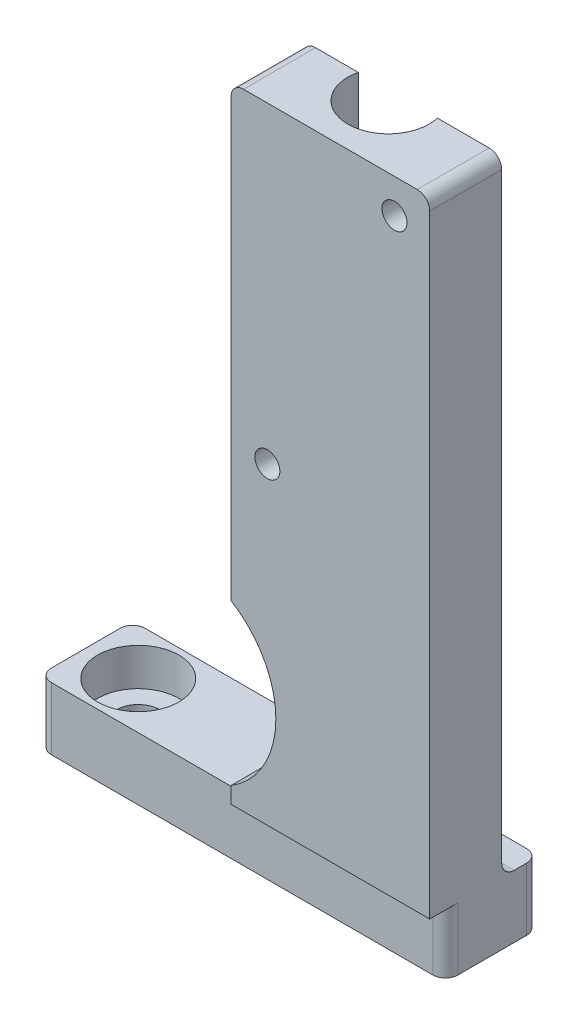
ISO-10303-21;
HEADER;
FILE_DESCRIPTION(('STEP AP214'),'2;1');
FILE_NAME('part.step','',(''),(''),'','','');
FILE_SCHEMA(('AUTOMOTIVE_DESIGN { 1 0 10303 214 1 1 1 1 }'));
ENDSEC;
DATA;
#1=APPLICATION_CONTEXT('core data for automotive mechanical design processes');
#2=APPLICATION_PROTOCOL_DEFINITION('international standard','automotive_design',2000,#1);
#3=PRODUCT_CONTEXT('',#1,'mechanical');
#4=PRODUCT('Part','Part','',(#3));
#5=PRODUCT_RELATED_PRODUCT_CATEGORY('part','',(#4));
#6=PRODUCT_DEFINITION_FORMATION('','',#4);
#7=PRODUCT_DEFINITION_CONTEXT('part definition',#1,'design');
#8=PRODUCT_DEFINITION('design','',#6,#7);
#9=PRODUCT_DEFINITION_SHAPE('','',#8);
#10=(LENGTH_UNIT() NAMED_UNIT(*) SI_UNIT(.MILLI.,.METRE.));
#11=(NAMED_UNIT(*) PLANE_ANGLE_UNIT() SI_UNIT($,.RADIAN.));
#12=(NAMED_UNIT(*) SI_UNIT($,.STERADIAN.) SOLID_ANGLE_UNIT());
#13=UNCERTAINTY_MEASURE_WITH_UNIT(LENGTH_MEASURE(1.E-05),#10,'distance_accuracy_value','');
#14=(GEOMETRIC_REPRESENTATION_CONTEXT(3) GLOBAL_UNCERTAINTY_ASSIGNED_CONTEXT((#13)) GLOBAL_UNIT_ASSIGNED_CONTEXT((#10,
#11,#12)) REPRESENTATION_CONTEXT('',''));
#15=CARTESIAN_POINT('',(0.,0.,0.));
#16=DIRECTION('',(0.,0.,1.));
#17=DIRECTION('',(1.,0.,0.));
#18=AXIS2_PLACEMENT_3D('',#15,#16,#17);
#19=CARTESIAN_POINT('',(16.62,-11.1608910645422,3.));
#20=DIRECTION('',(0.,0.,1.));
#21=DIRECTION('',(1.,0.,0.));
#22=AXIS2_PLACEMENT_3D('',#19,#20,#21);
#23=PLANE('',#22);
#24=CARTESIAN_POINT('',(29.68,52.275,3.));
#25=DIRECTION('',(0.,0.,1.));
#26=DIRECTION('',(1.,0.,0.));
#27=AXIS2_PLACEMENT_3D('',#24,#25,#26);
#28=CIRCLE('',#27,0.999999999999999);
#29=CARTESIAN_POINT('',(30.68,52.275,3.));
#30=VERTEX_POINT('',#29);
#31=EDGE_CURVE('E226',#30,#30,#28,.F.);
#32=ORIENTED_EDGE('',*,*,#31,.F.);
#33=EDGE_LOOP('',(#32));
#34=FACE_BOUND('',#33,.T.);
#35=DIRECTION('',(1.,0.,0.));
#36=VECTOR('',#35,1.);
#37=CARTESIAN_POINT('',(16.62,6.,3.));
#38=LINE('',#37,#36);
#39=CARTESIAN_POINT('',(32.5,6.,3.));
#40=VERTEX_POINT('',#39);
#41=CARTESIAN_POINT('',(27.362277660206,6.,3.));
#42=VERTEX_POINT('',#41);
#43=EDGE_CURVE('E199',#40,#42,#38,.F.);
#44=ORIENTED_EDGE('',*,*,#43,.T.);
#45=DIRECTION('',(0.,1.,0.));
#46=VECTOR('',#45,1.);
#47=CARTESIAN_POINT('',(27.362277660206,55.,3.));
#48=LINE('',#47,#46);
#49=CARTESIAN_POINT('',(27.362277660206,55.,3.));
#50=VERTEX_POINT('',#49);
#51=EDGE_CURVE('E54',#42,#50,#48,.T.);
#52=ORIENTED_EDGE('',*,*,#51,.T.);
#53=DIRECTION('',(1.,0.,0.));
#54=VECTOR('',#53,1.);
#55=CARTESIAN_POINT('',(16.62,55.,3.));
#56=LINE('',#55,#54);
#57=CARTESIAN_POINT('',(31.5,55.,3.));
#58=VERTEX_POINT('',#57);
#59=EDGE_CURVE('E195',#50,#58,#56,.T.);
#60=ORIENTED_EDGE('',*,*,#59,.T.);
#61=CARTESIAN_POINT('',(31.5,54.,3.));
#62=DIRECTION('',(0.,0.,1.));
#63=DIRECTION('',(1.,0.,0.));
#64=AXIS2_PLACEMENT_3D('',#61,#62,#63);
#65=CIRCLE('',#64,1.);
#66=CARTESIAN_POINT('',(32.5,54.,3.));
#67=VERTEX_POINT('',#66);
#68=EDGE_CURVE('E303',#58,#67,#65,.F.);
#69=ORIENTED_EDGE('',*,*,#68,.T.);
#70=DIRECTION('',(0.,1.,0.));
#71=VECTOR('',#70,1.);
#72=CARTESIAN_POINT('',(32.5,-11.1608910645422,3.));
#73=LINE('',#72,#71);
#74=EDGE_CURVE('E211',#40,#67,#73,.T.);
#75=ORIENTED_EDGE('',*,*,#74,.F.);
#76=EDGE_LOOP('',(#44,#52,#60,#69,#75));
#77=FACE_BOUND('',#76,.T.);
#78=ADVANCED_FACE('F33',(#34,#77),#23,.F.);
#79=CARTESIAN_POINT('',(32.5,55.,8.75));
#80=DIRECTION('',(0.,-1.,0.));
#81=DIRECTION('',(0.,0.,-1.));
#82=AXIS2_PLACEMENT_3D('',#79,#80,#81);
#83=PLANE('',#82);
#84=CARTESIAN_POINT('',(24.2000000000321,55.,3.74999999997677));
#85=DIRECTION('',(0.,1.,0.));
#86=DIRECTION('',(0.,0.,1.));
#87=AXIS2_PLACEMENT_3D('',#84,#85,#86);
#88=CIRCLE('',#87,3.25);
#89=CARTESIAN_POINT('',(21.0377223398582,55.,3.));
#90=VERTEX_POINT('',#89);
#91=EDGE_CURVE('E183',#90,#50,#88,.T.);
#92=ORIENTED_EDGE('',*,*,#91,.F.);
#93=CARTESIAN_POINT('',(17.62,55.,3.));
#94=VERTEX_POINT('',#93);
#95=EDGE_CURVE('E208',#94,#90,#56,.T.);
#96=ORIENTED_EDGE('',*,*,#95,.F.);
#97=DIRECTION('',(0.,0.,-1.));
#98=VECTOR('',#97,1.);
#99=CARTESIAN_POINT('',(17.62,55.,8.75));
#100=LINE('',#99,#98);
#101=CARTESIAN_POINT('',(17.62,55.,8.75));
#102=VERTEX_POINT('',#101);
#103=EDGE_CURVE('E337',#94,#102,#100,.F.);
#104=ORIENTED_EDGE('',*,*,#103,.T.);
#105=DIRECTION('',(-1.,0.,0.));
#106=VECTOR('',#105,1.);
#107=CARTESIAN_POINT('',(32.5,55.,8.75));
#108=LINE('',#107,#106);
#109=CARTESIAN_POINT('',(31.5,55.,8.75));
#110=VERTEX_POINT('',#109);
#111=EDGE_CURVE('E250',#110,#102,#108,.T.);
#112=ORIENTED_EDGE('',*,*,#111,.F.);
#113=DIRECTION('',(0.,0.,-1.));
#114=VECTOR('',#113,1.);
#115=CARTESIAN_POINT('',(31.5,55.,8.75));
#116=LINE('',#115,#114);
#117=EDGE_CURVE('E207',#110,#58,#116,.T.);
#118=ORIENTED_EDGE('',*,*,#117,.T.);
#119=ORIENTED_EDGE('',*,*,#59,.F.);
#120=EDGE_LOOP('',(#92,#96,#104,#112,#118,#119));
#121=FACE_BOUND('',#120,.T.);
#122=ADVANCED_FACE('F204',(#121),#83,.F.);
#123=CARTESIAN_POINT('',(0.,6.,2.));
#124=DIRECTION('',(-1.,0.,0.));
#125=DIRECTION('',(0.,0.,1.));
#126=AXIS2_PLACEMENT_3D('',#123,#124,#125);
#127=CYLINDRICAL_SURFACE('',#126,1.);
#128=CARTESIAN_POINT('',(21.0377223398582,6.,3.));
#129=VERTEX_POINT('',#128);
#130=CARTESIAN_POINT('',(16.62,6.,3.));
#131=VERTEX_POINT('',#130);
#132=EDGE_CURVE('E305',#129,#131,#38,.F.);
#133=ORIENTED_EDGE('',*,*,#132,.F.);
#134=CARTESIAN_POINT('',(21.0377223398582,6.,3.));
#135=CARTESIAN_POINT('',(21.0377243417344,5.97266350328819,3.00000013747066));
#136=CARTESIAN_POINT('',(21.0379881411846,5.94534004988354,2.99887831181392));
#137=CARTESIAN_POINT('',(21.0390532899592,5.89088779201237,2.99440508002577));
#138=CARTESIAN_POINT('',(21.0398546211615,5.86375898101492,2.99105374905911));
#139=CARTESIAN_POINT('',(21.0430823185972,5.78300339700947,2.97769159953253));
#140=CARTESIAN_POINT('',(21.0463323062041,5.7299162620022,2.96437251844341));
#141=CARTESIAN_POINT('',(21.0552656435906,5.62679527075438,2.92934867365648));
#142=CARTESIAN_POINT('',(21.0609504130985,5.57676321541775,2.90763901811313));
#143=CARTESIAN_POINT('',(21.0750947878721,5.48118325898409,2.85659882183702));
#144=CARTESIAN_POINT('',(21.0835538385147,5.43563446397611,2.82726980457969));
#145=CARTESIAN_POINT('',(21.1035903108635,5.3503505166675,2.7621223872445));
#146=CARTESIAN_POINT('',(21.1151624446697,5.31060568074592,2.72631502478564));
#147=CARTESIAN_POINT('',(21.1417102573434,5.23783660579636,2.64954114674054));
#148=CARTESIAN_POINT('',(21.1566849340808,5.20481039339103,2.6085761517808));
#149=CARTESIAN_POINT('',(21.1903649664133,5.1457458232653,2.52250103663701));
#150=CARTESIAN_POINT('',(21.2091126296373,5.11979537415567,2.47734735940692));
#151=CARTESIAN_POINT('',(21.2501717853667,5.0756045057692,2.38486979250385));
#152=CARTESIAN_POINT('',(21.2724882611214,5.0573749993003,2.33754293520679));
#153=CARTESIAN_POINT('',(21.3208731464244,5.02823208764174,2.24133592954518));
#154=CARTESIAN_POINT('',(21.3470070432618,5.01747054211555,2.19244357423257));
#155=CARTESIAN_POINT('',(21.4021470446259,5.00335154103514,2.09540137771363));
#156=CARTESIAN_POINT('',(21.4311439883131,4.99997122207713,2.04724970372234));
#157=CARTESIAN_POINT('',(21.4613872124914,5.,2.));
#158=B_SPLINE_CURVE_WITH_KNOTS('',3,(#134,#135,#136,#137,#138,#139,#140,#141,#142,#143,#144,
#145,#146,#147,#148,#149,#150,#151,#152,#153,#154,#155,#156,#157),.UNSPECIFIED.,.F.,.F.,(4,2,2,
2,2,2,2,2,2,2,2,4),(0.,0.0819592641523833,0.163915765299256,0.327558609654633,0.491297004801986,
0.655002685963879,0.818432032623257,0.981813307695379,1.14714042340767,1.31270043950487,
1.4815355399527,1.64984692614582),.UNSPECIFIED.);
#159=CARTESIAN_POINT('',(21.4613872124914,5.,2.));
#160=VERTEX_POINT('',#159);
#161=EDGE_CURVE('E11',#129,#160,#158,.T.);
#162=ORIENTED_EDGE('',*,*,#161,.T.);
#163=DIRECTION('',(1.,0.,0.));
#164=VECTOR('',#163,1.);
#165=CARTESIAN_POINT('',(32.5,5.,2.));
#166=LINE('',#165,#164);
#167=CARTESIAN_POINT('',(15.62,5.,2.));
#168=VERTEX_POINT('',#167);
#169=EDGE_CURVE('E286',#168,#160,#166,.T.);
#170=ORIENTED_EDGE('',*,*,#169,.F.);
#171=CARTESIAN_POINT('',(15.62,6.,2.));
#172=DIRECTION('',(-0.707106781186547,0.,0.707106781186547));
#173=DIRECTION('',(-0.707106781186547,0.,-0.707106781186547));
#174=AXIS2_PLACEMENT_3D('',#171,#172,#173);
#175=ELLIPSE('',#174,1.41421356237309,1.);
#176=EDGE_CURVE('E352',#131,#168,#175,.F.);
#177=ORIENTED_EDGE('',*,*,#176,.F.);
#178=EDGE_LOOP('',(#133,#162,#170,#177));
#179=FACE_BOUND('',#178,.T.);
#180=ADVANCED_FACE('F432',(#179),#127,.F.);
#181=CARTESIAN_POINT('',(16.62,5.,8.75));
#182=DIRECTION('',(1.,0.,0.));
#183=DIRECTION('',(0.,0.,-1.));
#184=AXIS2_PLACEMENT_3D('',#181,#182,#183);
#185=PLANE('',#184);
#186=DIRECTION('',(0.,1.,0.));
#187=VECTOR('',#186,1.);
#188=CARTESIAN_POINT('',(16.62,-11.1608910645422,3.));
#189=LINE('',#188,#187);
#190=CARTESIAN_POINT('',(16.62,19.0940284641218,3.));
#191=VERTEX_POINT('',#190);
#192=CARTESIAN_POINT('',(16.62,54.,3.));
#193=VERTEX_POINT('',#192);
#194=EDGE_CURVE('E220',#191,#193,#189,.T.);
#195=ORIENTED_EDGE('',*,*,#194,.F.);
#196=DIRECTION('',(0.,0.,1.));
#197=VECTOR('',#196,1.);
#198=CARTESIAN_POINT('',(16.62,19.0940284641218,-18.2132034355964));
#199=LINE('',#198,#197);
#200=CARTESIAN_POINT('',(16.62,19.0940284641218,8.75));
#201=VERTEX_POINT('',#200);
#202=EDGE_CURVE('E62',#191,#201,#199,.T.);
#203=ORIENTED_EDGE('',*,*,#202,.T.);
#204=DIRECTION('',(0.,-1.,0.));
#205=VECTOR('',#204,1.);
#206=CARTESIAN_POINT('',(16.62,5.,8.75));
#207=LINE('',#206,#205);
#208=CARTESIAN_POINT('',(16.62,54.,8.75));
#209=VERTEX_POINT('',#208);
#210=EDGE_CURVE('E255',#209,#201,#207,.T.);
#211=ORIENTED_EDGE('',*,*,#210,.F.);
#212=DIRECTION('',(0.,0.,-1.));
#213=VECTOR('',#212,1.);
#214=CARTESIAN_POINT('',(16.62,54.,8.75));
#215=LINE('',#214,#213);
#216=EDGE_CURVE('E292',#209,#193,#215,.T.);
#217=ORIENTED_EDGE('',*,*,#216,.T.);
#218=EDGE_LOOP('',(#195,#203,#211,#217));
#219=FACE_BOUND('',#218,.T.);
#220=ADVANCED_FACE('F416',(#219),#185,.F.);
#221=CARTESIAN_POINT('',(0.,0.,8.75));
#222=DIRECTION('',(0.,0.,-1.));
#223=DIRECTION('',(-1.,0.,0.));
#224=AXIS2_PLACEMENT_3D('',#221,#222,#223);
#225=PLANE('',#224);
#226=CARTESIAN_POINT('',(19.52,30.,8.75));
#227=DIRECTION('',(0.,0.,1.));
#228=DIRECTION('',(1.,0.,0.));
#229=AXIS2_PLACEMENT_3D('',#226,#227,#228);
#230=CIRCLE('',#229,1.);
#231=CARTESIAN_POINT('',(20.52,30.,8.75));
#232=VERTEX_POINT('',#231);
#233=EDGE_CURVE('E243',#232,#232,#230,.T.);
#234=ORIENTED_EDGE('',*,*,#233,.F.);
#235=EDGE_LOOP('',(#234));
#236=FACE_BOUND('',#235,.T.);
#237=ORIENTED_EDGE('',*,*,#210,.T.);
#238=CARTESIAN_POINT('',(12.7,12.7,8.75));
#239=DIRECTION('',(0.,0.,1.));
#240=DIRECTION('',(1.,0.,0.));
#241=AXIS2_PLACEMENT_3D('',#238,#239,#240);
#242=CIRCLE('',#241,7.5);
#243=CARTESIAN_POINT('',(16.62,6.30597153587815,8.75));
#244=VERTEX_POINT('',#243);
#245=EDGE_CURVE('E667',#244,#201,#242,.T.);
#246=ORIENTED_EDGE('',*,*,#245,.F.);
#247=CARTESIAN_POINT('',(16.62,5.,8.75));
#248=VERTEX_POINT('',#247);
#249=EDGE_CURVE('E254',#244,#248,#207,.T.);
#250=ORIENTED_EDGE('',*,*,#249,.T.);
#251=DIRECTION('',(-1.,0.,0.));
#252=VECTOR('',#251,1.);
#253=CARTESIAN_POINT('',(37.6538820320221,5.,8.75));
#254=LINE('',#253,#252);
#255=CARTESIAN_POINT('',(32.5,5.,8.75));
#256=VERTEX_POINT('',#255);
#257=EDGE_CURVE('E230',#256,#248,#254,.T.);
#258=ORIENTED_EDGE('',*,*,#257,.F.);
#259=DIRECTION('',(0.,1.,0.));
#260=VECTOR('',#259,1.);
#261=CARTESIAN_POINT('',(32.5,0.,8.75));
#262=LINE('',#261,#260);
#263=CARTESIAN_POINT('',(32.5,54.,8.75));
#264=VERTEX_POINT('',#263);
#265=EDGE_CURVE('E247',#256,#264,#262,.T.);
#266=ORIENTED_EDGE('',*,*,#265,.T.);
#267=CARTESIAN_POINT('',(31.5,54.,8.75));
#268=DIRECTION('',(0.,0.,-1.));
#269=DIRECTION('',(-1.,0.,0.));
#270=AXIS2_PLACEMENT_3D('',#267,#268,#269);
#271=CIRCLE('',#270,1.);
#272=EDGE_CURVE('E342',#264,#110,#271,.F.);
#273=ORIENTED_EDGE('',*,*,#272,.T.);
#274=ORIENTED_EDGE('',*,*,#111,.T.);
#275=CARTESIAN_POINT('',(17.62,54.,8.75));
#276=DIRECTION('',(0.,0.,-1.));
#277=DIRECTION('',(-1.,0.,0.));
#278=AXIS2_PLACEMENT_3D('',#275,#276,#277);
#279=CIRCLE('',#278,1.);
#280=EDGE_CURVE('E340',#102,#209,#279,.F.);
#281=ORIENTED_EDGE('',*,*,#280,.T.);
#282=EDGE_LOOP('',(#237,#246,#250,#258,#266,#273,#274,#281));
#283=FACE_BOUND('',#282,.T.);
#284=CARTESIAN_POINT('',(29.68,52.275,8.75));
#285=DIRECTION('',(0.,0.,1.));
#286=DIRECTION('',(1.,0.,0.));
#287=AXIS2_PLACEMENT_3D('',#284,#285,#286);
#288=CIRCLE('',#287,1.);
#289=CARTESIAN_POINT('',(30.68,52.275,8.75));
#290=VERTEX_POINT('',#289);
#291=EDGE_CURVE('E240',#290,#290,#288,.T.);
#292=ORIENTED_EDGE('',*,*,#291,.F.);
#293=EDGE_LOOP('',(#292));
#294=FACE_BOUND('',#293,.T.);
#295=ADVANCED_FACE('F412',(#236,#283,#294),#225,.F.);
#296=CARTESIAN_POINT('',(0.,0.,8.75));
#297=DIRECTION('',(1.,0.,0.));
#298=DIRECTION('',(0.,0.,-1.));
#299=AXIS2_PLACEMENT_3D('',#296,#297,#298);
#300=PLANE('',#299);
#301=DIRECTION('',(0.,0.,-1.));
#302=VECTOR('',#301,1.);
#303=CARTESIAN_POINT('',(0.,0.,8.75));
#304=LINE('',#303,#302);
#305=CARTESIAN_POINT('',(0.,0.,6.5));
#306=VERTEX_POINT('',#305);
#307=CARTESIAN_POINT('',(0.,0.,1.));
#308=VERTEX_POINT('',#307);
#309=EDGE_CURVE('E271',#306,#308,#304,.T.);
#310=ORIENTED_EDGE('',*,*,#309,.F.);
#311=DIRECTION('',(0.,-1.,0.));
#312=VECTOR('',#311,1.);
#313=CARTESIAN_POINT('',(0.,0.,6.5));
#314=LINE('',#313,#312);
#315=CARTESIAN_POINT('',(0.,5.,6.5));
#316=VERTEX_POINT('',#315);
#317=EDGE_CURVE('E335',#306,#316,#314,.F.);
#318=ORIENTED_EDGE('',*,*,#317,.T.);
#319=DIRECTION('',(0.,0.,-1.));
#320=VECTOR('',#319,1.);
#321=CARTESIAN_POINT('',(0.,5.,8.75));
#322=LINE('',#321,#320);
#323=CARTESIAN_POINT('',(0.,5.,1.));
#324=VERTEX_POINT('',#323);
#325=EDGE_CURVE('E258',#316,#324,#322,.T.);
#326=ORIENTED_EDGE('',*,*,#325,.T.);
#327=DIRECTION('',(0.,-1.,0.));
#328=VECTOR('',#327,1.);
#329=CARTESIAN_POINT('',(0.,0.,1.));
#330=LINE('',#329,#328);
#331=EDGE_CURVE('E332',#324,#308,#330,.T.);
#332=ORIENTED_EDGE('',*,*,#331,.T.);
#333=EDGE_LOOP('',(#310,#318,#326,#332));
#334=FACE_BOUND('',#333,.T.);
#335=ADVANCED_FACE('F415',(#334),#300,.F.);
#336=CARTESIAN_POINT('',(0.,0.,8.75));
#337=DIRECTION('',(0.,1.,0.));
#338=DIRECTION('',(0.,0.,1.));
#339=AXIS2_PLACEMENT_3D('',#336,#337,#338);
#340=PLANE('',#339);
#341=CARTESIAN_POINT('',(24.2000000000321,0.,3.74999999997677));
#342=DIRECTION('',(0.,1.,0.));
#343=DIRECTION('',(0.,0.,1.));
#344=AXIS2_PLACEMENT_3D('',#341,#342,#343);
#345=CIRCLE('',#344,1.69999999999999);
#346=CARTESIAN_POINT('',(24.2000000000321,0.,5.44999999997675));
#347=VERTEX_POINT('',#346);
#348=EDGE_CURVE('E201',#347,#347,#345,.T.);
#349=ORIENTED_EDGE('',*,*,#348,.T.);
#350=EDGE_LOOP('',(#349));
#351=FACE_BOUND('',#350,.T.);
#352=CARTESIAN_POINT('',(4.20000000003208,0.,3.74999999997682));
#353=DIRECTION('',(0.,1.,0.));
#354=DIRECTION('',(0.,0.,1.));
#355=AXIS2_PLACEMENT_3D('',#352,#353,#354);
#356=CIRCLE('',#355,1.7);
#357=CARTESIAN_POINT('',(4.20000000003208,0.,5.44999999997682));
#358=VERTEX_POINT('',#357);
#359=EDGE_CURVE('E209',#358,#358,#356,.T.);
#360=ORIENTED_EDGE('',*,*,#359,.T.);
#361=EDGE_LOOP('',(#360));
#362=FACE_BOUND('',#361,.T.);
#363=DIRECTION('',(0.,0.,-1.));
#364=VECTOR('',#363,1.);
#365=CARTESIAN_POINT('',(32.5,0.,8.75));
#366=LINE('',#365,#364);
#367=CARTESIAN_POINT('',(32.5,0.,6.5));
#368=VERTEX_POINT('',#367);
#369=CARTESIAN_POINT('',(32.5,0.,1.));
#370=VERTEX_POINT('',#369);
#371=EDGE_CURVE('E268',#368,#370,#366,.T.);
#372=ORIENTED_EDGE('',*,*,#371,.F.);
#373=CARTESIAN_POINT('',(31.5,0.,6.5));
#374=DIRECTION('',(0.,1.,0.));
#375=DIRECTION('',(0.,0.,1.));
#376=AXIS2_PLACEMENT_3D('',#373,#374,#375);
#377=CIRCLE('',#376,1.);
#378=CARTESIAN_POINT('',(31.5,0.,7.5));
#379=VERTEX_POINT('',#378);
#380=EDGE_CURVE('E326',#368,#379,#377,.F.);
#381=ORIENTED_EDGE('',*,*,#380,.T.);
#382=DIRECTION('',(-1.,0.,0.));
#383=VECTOR('',#382,1.);
#384=CARTESIAN_POINT('',(37.6538820320221,0.,7.5));
#385=LINE('',#384,#383);
#386=CARTESIAN_POINT('',(1.00000000000001,0.,7.5));
#387=VERTEX_POINT('',#386);
#388=EDGE_CURVE('E231',#379,#387,#385,.T.);
#389=ORIENTED_EDGE('',*,*,#388,.T.);
#390=CARTESIAN_POINT('',(1.,0.,6.5));
#391=DIRECTION('',(0.,1.,0.));
#392=DIRECTION('',(0.,0.,1.));
#393=AXIS2_PLACEMENT_3D('',#390,#391,#392);
#394=CIRCLE('',#393,1.);
#395=EDGE_CURVE('E322',#387,#306,#394,.F.);
#396=ORIENTED_EDGE('',*,*,#395,.T.);
#397=ORIENTED_EDGE('',*,*,#309,.T.);
#398=CARTESIAN_POINT('',(1.,0.,1.));
#399=DIRECTION('',(0.,1.,0.));
#400=DIRECTION('',(0.,0.,1.));
#401=AXIS2_PLACEMENT_3D('',#398,#399,#400);
#402=CIRCLE('',#401,1.);
#403=CARTESIAN_POINT('',(1.,0.,0.));
#404=VERTEX_POINT('',#403);
#405=EDGE_CURVE('E320',#308,#404,#402,.F.);
#406=ORIENTED_EDGE('',*,*,#405,.T.);
#407=DIRECTION('',(1.,0.,0.));
#408=VECTOR('',#407,1.);
#409=CARTESIAN_POINT('',(0.,0.,0.));
#410=LINE('',#409,#408);
#411=CARTESIAN_POINT('',(31.5,0.,0.));
#412=VERTEX_POINT('',#411);
#413=EDGE_CURVE('E246',#404,#412,#410,.T.);
#414=ORIENTED_EDGE('',*,*,#413,.T.);
#415=CARTESIAN_POINT('',(31.5,0.,1.));
#416=DIRECTION('',(0.,1.,0.));
#417=DIRECTION('',(0.,0.,1.));
#418=AXIS2_PLACEMENT_3D('',#415,#416,#417);
#419=CIRCLE('',#418,1.);
#420=EDGE_CURVE('E324',#412,#370,#419,.F.);
#421=ORIENTED_EDGE('',*,*,#420,.T.);
#422=EDGE_LOOP('',(#372,#381,#389,#396,#397,#406,#414,#421));
#423=FACE_BOUND('',#422,.T.);
#424=ADVANCED_FACE('F435',(#351,#362,#423),#340,.F.);
#425=CARTESIAN_POINT('',(32.5,4.23976608187134,8.75));
#426=DIRECTION('',(-1.,0.,0.));
#427=DIRECTION('',(0.,0.,1.));
#428=AXIS2_PLACEMENT_3D('',#425,#426,#427);
#429=PLANE('',#428);
#430=DIRECTION('',(0.,0.,1.));
#431=VECTOR('',#430,1.);
#432=CARTESIAN_POINT('',(32.5,5.,8.75));
#433=LINE('',#432,#431);
#434=CARTESIAN_POINT('',(32.5,5.,6.5));
#435=VERTEX_POINT('',#434);
#436=EDGE_CURVE('E234',#435,#256,#433,.T.);
#437=ORIENTED_EDGE('',*,*,#436,.F.);
#438=DIRECTION('',(0.,1.,0.));
#439=VECTOR('',#438,1.);
#440=CARTESIAN_POINT('',(32.5,4.23976608187134,6.5));
#441=LINE('',#440,#439);
#442=EDGE_CURVE('E318',#435,#368,#441,.F.);
#443=ORIENTED_EDGE('',*,*,#442,.T.);
#444=ORIENTED_EDGE('',*,*,#371,.T.);
#445=DIRECTION('',(0.,1.,0.));
#446=VECTOR('',#445,1.);
#447=CARTESIAN_POINT('',(32.5,5.,1.));
#448=LINE('',#447,#446);
#449=CARTESIAN_POINT('',(32.5,5.,1.));
#450=VERTEX_POINT('',#449);
#451=EDGE_CURVE('E315',#370,#450,#448,.T.);
#452=ORIENTED_EDGE('',*,*,#451,.T.);
#453=DIRECTION('',(0.,0.,-1.));
#454=VECTOR('',#453,1.);
#455=CARTESIAN_POINT('',(32.5,5.,0.));
#456=LINE('',#455,#454);
#457=CARTESIAN_POINT('',(32.5,5.,2.));
#458=VERTEX_POINT('',#457);
#459=EDGE_CURVE('E217',#458,#450,#456,.T.);
#460=ORIENTED_EDGE('',*,*,#459,.F.);
#461=CARTESIAN_POINT('',(32.5,6.,2.));
#462=DIRECTION('',(-1.,0.,0.));
#463=DIRECTION('',(0.,0.,1.));
#464=AXIS2_PLACEMENT_3D('',#461,#462,#463);
#465=CIRCLE('',#464,1.);
#466=EDGE_CURVE('E346',#458,#40,#465,.T.);
#467=ORIENTED_EDGE('',*,*,#466,.T.);
#468=ORIENTED_EDGE('',*,*,#74,.T.);
#469=DIRECTION('',(0.,0.,-1.));
#470=VECTOR('',#469,1.);
#471=CARTESIAN_POINT('',(32.5,54.,8.75));
#472=LINE('',#471,#470);
#473=EDGE_CURVE('E313',#67,#264,#472,.F.);
#474=ORIENTED_EDGE('',*,*,#473,.T.);
#475=ORIENTED_EDGE('',*,*,#265,.F.);
#476=EDGE_LOOP('',(#437,#443,#444,#452,#460,#467,#468,#474,#475));
#477=FACE_BOUND('',#476,.T.);
#478=ADVANCED_FACE('F428',(#477),#429,.F.);
#479=ORIENTED_EDGE('',*,*,#249,.F.);
#480=DIRECTION('',(0.,0.,1.));
#481=VECTOR('',#480,1.);
#482=CARTESIAN_POINT('',(16.62,6.30597153587815,-18.2132034355964));
#483=LINE('',#482,#481);
#484=CARTESIAN_POINT('',(16.62,6.30597153587815,3.));
#485=VERTEX_POINT('',#484);
#486=EDGE_CURVE('E672',#244,#485,#483,.F.);
#487=ORIENTED_EDGE('',*,*,#486,.T.);
#488=EDGE_CURVE('E223',#131,#485,#189,.T.);
#489=ORIENTED_EDGE('',*,*,#488,.F.);
#490=DIRECTION('',(0.,0.,-1.));
#491=VECTOR('',#490,1.);
#492=CARTESIAN_POINT('',(16.62,6.,7.5));
#493=LINE('',#492,#491);
#494=CARTESIAN_POINT('',(16.62,6.,7.5));
#495=VERTEX_POINT('',#494);
#496=EDGE_CURVE('E298',#131,#495,#493,.F.);
#497=ORIENTED_EDGE('',*,*,#496,.T.);
#498=DIRECTION('',(0.,-1.,0.));
#499=VECTOR('',#498,1.);
#500=CARTESIAN_POINT('',(16.62,5.,7.5));
#501=LINE('',#500,#499);
#502=CARTESIAN_POINT('',(16.62,5.,7.5));
#503=VERTEX_POINT('',#502);
#504=EDGE_CURVE('E295',#495,#503,#501,.T.);
#505=ORIENTED_EDGE('',*,*,#504,.T.);
#506=DIRECTION('',(0.,0.,-1.));
#507=VECTOR('',#506,1.);
#508=CARTESIAN_POINT('',(16.62,5.,8.75));
#509=LINE('',#508,#507);
#510=EDGE_CURVE('E265',#248,#503,#509,.T.);
#511=ORIENTED_EDGE('',*,*,#510,.F.);
#512=EDGE_LOOP('',(#479,#487,#489,#497,#505,#511));
#513=FACE_BOUND('',#512,.T.);
#514=ADVANCED_FACE('F424',(#513),#185,.F.);
#515=CARTESIAN_POINT('',(0.,5.,8.75));
#516=DIRECTION('',(0.,-1.,0.));
#517=DIRECTION('',(0.,0.,-1.));
#518=AXIS2_PLACEMENT_3D('',#515,#516,#517);
#519=PLANE('',#518);
#520=CARTESIAN_POINT('',(4.20000000003208,5.,3.74999999997682));
#521=DIRECTION('',(0.,1.,0.));
#522=DIRECTION('',(0.,0.,1.));
#523=AXIS2_PLACEMENT_3D('',#520,#521,#522);
#524=CIRCLE('',#523,3.25);
#525=CARTESIAN_POINT('',(4.20000000003208,5.,6.99999999997682));
#526=VERTEX_POINT('',#525);
#527=EDGE_CURVE('E354',#526,#526,#524,.T.);
#528=ORIENTED_EDGE('',*,*,#527,.F.);
#529=EDGE_LOOP('',(#528));
#530=FACE_BOUND('',#529,.T.);
#531=ORIENTED_EDGE('',*,*,#169,.T.);
#532=CARTESIAN_POINT('',(24.2000000000321,5.,3.74999999997677));
#533=DIRECTION('',(0.,-1.,0.));
#534=DIRECTION('',(0.,0.,-1.));
#535=AXIS2_PLACEMENT_3D('',#532,#533,#534);
#536=CIRCLE('',#535,3.24999999999999);
#537=CARTESIAN_POINT('',(26.9386127875728,5.,2.));
#538=VERTEX_POINT('',#537);
#539=EDGE_CURVE('E200',#160,#538,#536,.T.);
#540=ORIENTED_EDGE('',*,*,#539,.T.);
#541=EDGE_CURVE('E285',#538,#458,#166,.T.);
#542=ORIENTED_EDGE('',*,*,#541,.T.);
#543=ORIENTED_EDGE('',*,*,#459,.T.);
#544=CARTESIAN_POINT('',(31.5,5.,1.));
#545=DIRECTION('',(0.,-1.,0.));
#546=DIRECTION('',(0.,0.,-1.));
#547=AXIS2_PLACEMENT_3D('',#544,#545,#546);
#548=CIRCLE('',#547,1.);
#549=CARTESIAN_POINT('',(31.5,5.,0.));
#550=VERTEX_POINT('',#549);
#551=EDGE_CURVE('E283',#450,#550,#548,.F.);
#552=ORIENTED_EDGE('',*,*,#551,.T.);
#553=DIRECTION('',(-1.,0.,0.));
#554=VECTOR('',#553,1.);
#555=CARTESIAN_POINT('',(0.,5.,0.));
#556=LINE('',#555,#554);
#557=CARTESIAN_POINT('',(1.,5.,0.));
#558=VERTEX_POINT('',#557);
#559=EDGE_CURVE('E251',#550,#558,#556,.T.);
#560=ORIENTED_EDGE('',*,*,#559,.T.);
#561=CARTESIAN_POINT('',(1.,5.,1.));
#562=DIRECTION('',(0.,-1.,0.));
#563=DIRECTION('',(0.,0.,-1.));
#564=AXIS2_PLACEMENT_3D('',#561,#562,#563);
#565=CIRCLE('',#564,1.);
#566=EDGE_CURVE('E277',#558,#324,#565,.F.);
#567=ORIENTED_EDGE('',*,*,#566,.T.);
#568=ORIENTED_EDGE('',*,*,#325,.F.);
#569=CARTESIAN_POINT('',(1.,5.,6.5));
#570=DIRECTION('',(0.,-1.,0.));
#571=DIRECTION('',(0.,0.,-1.));
#572=AXIS2_PLACEMENT_3D('',#569,#570,#571);
#573=CIRCLE('',#572,1.);
#574=CARTESIAN_POINT('',(1.,5.,7.5));
#575=VERTEX_POINT('',#574);
#576=EDGE_CURVE('E281',#316,#575,#573,.F.);
#577=ORIENTED_EDGE('',*,*,#576,.T.);
#578=DIRECTION('',(1.,0.,0.));
#579=VECTOR('',#578,1.);
#580=CARTESIAN_POINT('',(0.,5.,7.5));
#581=LINE('',#580,#579);
#582=CARTESIAN_POINT('',(15.62,5.,7.5));
#583=VERTEX_POINT('',#582);
#584=EDGE_CURVE('E274',#575,#583,#581,.T.);
#585=ORIENTED_EDGE('',*,*,#584,.T.);
#586=DIRECTION('',(0.,0.,-1.));
#587=VECTOR('',#586,1.);
#588=CARTESIAN_POINT('',(15.62,5.,3.));
#589=LINE('',#588,#587);
#590=EDGE_CURVE('E289',#583,#168,#589,.T.);
#591=ORIENTED_EDGE('',*,*,#590,.T.);
#592=EDGE_LOOP('',(#531,#540,#542,#543,#552,#560,#567,#568,#577,#585,#591));
#593=FACE_BOUND('',#592,.T.);
#594=ADVANCED_FACE('F420',(#530,#593),#519,.F.);
#595=CARTESIAN_POINT('',(0.,0.,0.));
#596=DIRECTION('',(0.,0.,-1.));
#597=DIRECTION('',(-1.,0.,0.));
#598=AXIS2_PLACEMENT_3D('',#595,#596,#597);
#599=PLANE('',#598);
#600=ORIENTED_EDGE('',*,*,#559,.F.);
#601=DIRECTION('',(0.,1.,0.));
#602=VECTOR('',#601,1.);
#603=CARTESIAN_POINT('',(31.5,0.,0.));
#604=LINE('',#603,#602);
#605=EDGE_CURVE('E330',#550,#412,#604,.F.);
#606=ORIENTED_EDGE('',*,*,#605,.T.);
#607=ORIENTED_EDGE('',*,*,#413,.F.);
#608=DIRECTION('',(0.,-1.,0.));
#609=VECTOR('',#608,1.);
#610=CARTESIAN_POINT('',(1.,5.,0.));
#611=LINE('',#610,#609);
#612=EDGE_CURVE('E328',#404,#558,#611,.F.);
#613=ORIENTED_EDGE('',*,*,#612,.T.);
#614=EDGE_LOOP('',(#600,#606,#607,#613));
#615=FACE_BOUND('',#614,.T.);
#616=ADVANCED_FACE('F410',(#615),#599,.T.);
#617=CARTESIAN_POINT('',(19.52,30.,8.75));
#618=DIRECTION('',(0.,0.,1.));
#619=DIRECTION('',(1.,0.,0.));
#620=AXIS2_PLACEMENT_3D('',#617,#618,#619);
#621=CYLINDRICAL_SURFACE('',#620,0.999999999999999);
#622=CARTESIAN_POINT('',(19.52,30.,3.));
#623=DIRECTION('',(0.,0.,1.));
#624=DIRECTION('',(1.,0.,0.));
#625=AXIS2_PLACEMENT_3D('',#622,#623,#624);
#626=CIRCLE('',#625,0.999999999999999);
#627=CARTESIAN_POINT('',(20.52,30.,3.));
#628=VERTEX_POINT('',#627);
#629=EDGE_CURVE('E227',#628,#628,#626,.F.);
#630=ORIENTED_EDGE('',*,*,#629,.T.);
#631=EDGE_LOOP('',(#630));
#632=FACE_BOUND('',#631,.T.);
#633=ORIENTED_EDGE('',*,*,#233,.T.);
#634=EDGE_LOOP('',(#633));
#635=FACE_BOUND('',#634,.T.);
#636=ADVANCED_FACE('F406',(#632,#635),#621,.F.);
#637=CARTESIAN_POINT('',(29.68,52.275,8.75));
#638=DIRECTION('',(0.,0.,1.));
#639=DIRECTION('',(1.,0.,0.));
#640=AXIS2_PLACEMENT_3D('',#637,#638,#639);
#641=CYLINDRICAL_SURFACE('',#640,0.999999999999999);
#642=ORIENTED_EDGE('',*,*,#31,.T.);
#643=EDGE_LOOP('',(#642));
#644=FACE_BOUND('',#643,.T.);
#645=ORIENTED_EDGE('',*,*,#291,.T.);
#646=EDGE_LOOP('',(#645));
#647=FACE_BOUND('',#646,.T.);
#648=ADVANCED_FACE('F402',(#644,#647),#641,.F.);
#649=CARTESIAN_POINT('',(37.6538820320221,5.,8.75));
#650=DIRECTION('',(0.,1.,0.));
#651=DIRECTION('',(0.,0.,1.));
#652=AXIS2_PLACEMENT_3D('',#649,#650,#651);
#653=PLANE('',#652);
#654=DIRECTION('',(-1.,0.,0.));
#655=VECTOR('',#654,1.);
#656=CARTESIAN_POINT('',(37.6538820320221,5.,7.5));
#657=LINE('',#656,#655);
#658=CARTESIAN_POINT('',(31.5,5.,7.5));
#659=VERTEX_POINT('',#658);
#660=EDGE_CURVE('E235',#659,#503,#657,.T.);
#661=ORIENTED_EDGE('',*,*,#660,.F.);
#662=CARTESIAN_POINT('',(31.5,5.,6.5));
#663=DIRECTION('',(0.,1.,0.));
#664=DIRECTION('',(0.,0.,1.));
#665=AXIS2_PLACEMENT_3D('',#662,#663,#664);
#666=CIRCLE('',#665,1.);
#667=EDGE_CURVE('E348',#659,#435,#666,.T.);
#668=ORIENTED_EDGE('',*,*,#667,.T.);
#669=ORIENTED_EDGE('',*,*,#436,.T.);
#670=ORIENTED_EDGE('',*,*,#257,.T.);
#671=ORIENTED_EDGE('',*,*,#510,.T.);
#672=EDGE_LOOP('',(#661,#668,#669,#670,#671));
#673=FACE_BOUND('',#672,.T.);
#674=ADVANCED_FACE('F398',(#673),#653,.F.);
#675=CARTESIAN_POINT('',(37.6538820320221,5.,7.5));
#676=DIRECTION('',(0.,0.,-1.));
#677=DIRECTION('',(0.,1.,0.));
#678=AXIS2_PLACEMENT_3D('',#675,#676,#677);
#679=PLANE('',#678);
#680=ORIENTED_EDGE('',*,*,#388,.F.);
#681=DIRECTION('',(0.,1.,0.));
#682=VECTOR('',#681,1.);
#683=CARTESIAN_POINT('',(31.5,5.,7.5));
#684=LINE('',#683,#682);
#685=EDGE_CURVE('E310',#379,#659,#684,.T.);
#686=ORIENTED_EDGE('',*,*,#685,.T.);
#687=ORIENTED_EDGE('',*,*,#660,.T.);
#688=ORIENTED_EDGE('',*,*,#504,.F.);
#689=CARTESIAN_POINT('',(15.62,6.,7.5));
#690=DIRECTION('',(0.,0.,-1.));
#691=DIRECTION('',(0.,1.,0.));
#692=AXIS2_PLACEMENT_3D('',#689,#690,#691);
#693=CIRCLE('',#692,1.);
#694=EDGE_CURVE('E344',#495,#583,#693,.T.);
#695=ORIENTED_EDGE('',*,*,#694,.T.);
#696=ORIENTED_EDGE('',*,*,#584,.F.);
#697=DIRECTION('',(0.,-1.,0.));
#698=VECTOR('',#697,1.);
#699=CARTESIAN_POINT('',(1.,5.,7.5));
#700=LINE('',#699,#698);
#701=EDGE_CURVE('E307',#575,#387,#700,.T.);
#702=ORIENTED_EDGE('',*,*,#701,.T.);
#703=EDGE_LOOP('',(#680,#686,#687,#688,#695,#696,#702));
#704=FACE_BOUND('',#703,.T.);
#705=ADVANCED_FACE('F394',(#704),#679,.F.);
#706=ORIENTED_EDGE('',*,*,#95,.T.);
#707=DIRECTION('',(0.,1.,0.));
#708=VECTOR('',#707,1.);
#709=CARTESIAN_POINT('',(21.0377223398582,55.,3.));
#710=LINE('',#709,#708);
#711=EDGE_CURVE('E186',#90,#129,#710,.F.);
#712=ORIENTED_EDGE('',*,*,#711,.T.);
#713=ORIENTED_EDGE('',*,*,#132,.T.);
#714=ORIENTED_EDGE('',*,*,#488,.T.);
#715=CARTESIAN_POINT('',(12.7,12.7,3.));
#716=DIRECTION('',(0.,0.,1.));
#717=DIRECTION('',(1.,0.,0.));
#718=AXIS2_PLACEMENT_3D('',#715,#716,#717);
#719=CIRCLE('',#718,7.5);
#720=EDGE_CURVE('E351',#485,#191,#719,.T.);
#721=ORIENTED_EDGE('',*,*,#720,.T.);
#722=ORIENTED_EDGE('',*,*,#194,.T.);
#723=CARTESIAN_POINT('',(17.62,54.,3.));
#724=DIRECTION('',(0.,0.,1.));
#725=DIRECTION('',(1.,0.,0.));
#726=AXIS2_PLACEMENT_3D('',#723,#724,#725);
#727=CIRCLE('',#726,1.);
#728=EDGE_CURVE('E301',#193,#94,#727,.F.);
#729=ORIENTED_EDGE('',*,*,#728,.T.);
#730=EDGE_LOOP('',(#706,#712,#713,#714,#721,#722,#729));
#731=FACE_BOUND('',#730,.T.);
#732=ORIENTED_EDGE('',*,*,#629,.F.);
#733=EDGE_LOOP('',(#732));
#734=FACE_BOUND('',#733,.T.);
#735=ADVANCED_FACE('F390',(#731,#734),#23,.F.);
#736=CARTESIAN_POINT('',(4.20000000003208,5.,3.74999999997682));
#737=DIRECTION('',(0.,1.,0.));
#738=DIRECTION('',(0.,0.,1.));
#739=AXIS2_PLACEMENT_3D('',#736,#737,#738);
#740=CYLINDRICAL_SURFACE('',#739,1.7);
#741=ORIENTED_EDGE('',*,*,#359,.F.);
#742=EDGE_LOOP('',(#741));
#743=FACE_BOUND('',#742,.T.);
#744=CARTESIAN_POINT('',(4.20000000003208,2.,3.74999999997682));
#745=DIRECTION('',(0.,1.,0.));
#746=DIRECTION('',(0.,0.,1.));
#747=AXIS2_PLACEMENT_3D('',#744,#745,#746);
#748=CIRCLE('',#747,1.7);
#749=CARTESIAN_POINT('',(4.20000000003208,2.,5.44999999997682));
#750=VERTEX_POINT('',#749);
#751=EDGE_CURVE('E213',#750,#750,#748,.T.);
#752=ORIENTED_EDGE('',*,*,#751,.T.);
#753=EDGE_LOOP('',(#752));
#754=FACE_BOUND('',#753,.T.);
#755=ADVANCED_FACE('F386',(#743,#754),#740,.F.);
#756=CARTESIAN_POINT('',(5.90000000003208,2.,3.74999999997682));
#757=DIRECTION('',(0.,-1.,0.));
#758=DIRECTION('',(0.,0.,-1.));
#759=AXIS2_PLACEMENT_3D('',#756,#757,#758);
#760=PLANE('',#759);
#761=ORIENTED_EDGE('',*,*,#751,.F.);
#762=EDGE_LOOP('',(#761));
#763=FACE_BOUND('',#762,.T.);
#764=CARTESIAN_POINT('',(4.20000000003208,2.,3.74999999997682));
#765=DIRECTION('',(0.,1.,0.));
#766=DIRECTION('',(0.,0.,1.));
#767=AXIS2_PLACEMENT_3D('',#764,#765,#766);
#768=CIRCLE('',#767,3.25);
#769=CARTESIAN_POINT('',(4.20000000003208,2.,6.99999999997682));
#770=VERTEX_POINT('',#769);
#771=EDGE_CURVE('E678',#770,#770,#768,.T.);
#772=ORIENTED_EDGE('',*,*,#771,.T.);
#773=EDGE_LOOP('',(#772));
#774=FACE_BOUND('',#773,.T.);
#775=ADVANCED_FACE('F382',(#763,#774),#760,.F.);
#776=CARTESIAN_POINT('',(4.20000000003208,5.,3.74999999997682));
#777=DIRECTION('',(0.,1.,0.));
#778=DIRECTION('',(0.,0.,1.));
#779=AXIS2_PLACEMENT_3D('',#776,#777,#778);
#780=CYLINDRICAL_SURFACE('',#779,3.25);
#781=ORIENTED_EDGE('',*,*,#771,.F.);
#782=EDGE_LOOP('',(#781));
#783=FACE_BOUND('',#782,.T.);
#784=ORIENTED_EDGE('',*,*,#527,.T.);
#785=EDGE_LOOP('',(#784));
#786=FACE_BOUND('',#785,.T.);
#787=ADVANCED_FACE('F379',(#783,#786),#780,.F.);
#788=ORIENTED_EDGE('',*,*,#541,.F.);
#789=CARTESIAN_POINT('',(26.9386127875728,5.,2.));
#790=CARTESIAN_POINT('',(26.9559481152209,5.00000184903357,2.02712530066541));
#791=CARTESIAN_POINT('',(26.9728729690711,5.00110484652218,2.05450409186592));
#792=CARTESIAN_POINT('',(27.0058350715956,5.00564134262943,2.10962771558742));
#793=CARTESIAN_POINT('',(27.0218716267305,5.00907663520417,2.13737281374461));
#794=CARTESIAN_POINT('',(27.0686181525266,5.0231037615879,2.22107693058647));
#795=CARTESIAN_POINT('',(27.097842572416,5.03741867509132,2.27731274895997));
#796=CARTESIAN_POINT('',(27.151772655881,5.07669987318711,2.38860859470801));
#797=CARTESIAN_POINT('',(27.1764554932155,5.1017179678583,2.44366151671692));
#798=CARTESIAN_POINT('',(27.2207546331118,5.16238866380053,2.54965327711379));
#799=CARTESIAN_POINT('',(27.2403842343374,5.1980128082792,2.60060266658797));
#800=CARTESIAN_POINT('',(27.2728820695537,5.27477381260862,2.69077749421021));
#801=CARTESIAN_POINT('',(27.2862486021295,5.31491514503406,2.73067393702297));
#802=CARTESIAN_POINT('',(27.3093643231829,5.40202646898917,2.80352330441562));
#803=CARTESIAN_POINT('',(27.3191116905334,5.4489998818526,2.83647272973303));
#804=CARTESIAN_POINT('',(27.3349609597444,5.54566393069824,2.89248877452609));
#805=CARTESIAN_POINT('',(27.3412285333465,5.59507906952135,2.91598624227848));
#806=CARTESIAN_POINT('',(27.3512388915869,5.69728290901102,2.95464157761979));
#807=CARTESIAN_POINT('',(27.3549840049652,5.7500684486815,2.96980713485362));
#808=CARTESIAN_POINT('',(27.3591773612685,5.83604056715378,2.98701829148011));
#809=CARTESIAN_POINT('',(27.3603446585559,5.86865602677035,2.9918838162094));
#810=CARTESIAN_POINT('',(27.3618920950092,5.93417618797978,2.998373670893));
#811=CARTESIAN_POINT('',(27.362273428876,5.9670803741153,3.00000291999966));
#812=CARTESIAN_POINT('',(27.362277660206,6.,3.));
#813=B_SPLINE_CURVE_WITH_KNOTS('',3,(#789,#790,#791,#792,#793,#794,#795,#796,#797,#798,#799,
#800,#801,#802,#803,#804,#805,#806,#807,#808,#809,#810,#811,#812),.UNSPECIFIED.,.F.,.F.,(4,2,2,
2,2,2,2,2,2,2,2,4),(0.,0.0965322353527143,0.193138805674745,0.387027246798146,0.581865041470818,
0.776184712607812,0.949744647848711,1.12339179870813,1.28784612286136,1.45214841359404,
1.55098470489061,1.64967064930268),.UNSPECIFIED.);
#814=EDGE_CURVE('E47',#538,#42,#813,.T.);
#815=ORIENTED_EDGE('',*,*,#814,.T.);
#816=ORIENTED_EDGE('',*,*,#43,.F.);
#817=ORIENTED_EDGE('',*,*,#466,.F.);
#818=EDGE_LOOP('',(#788,#815,#816,#817));
#819=FACE_BOUND('',#818,.T.);
#820=ADVANCED_FACE('F359',(#819),#127,.F.);
#821=CARTESIAN_POINT('',(15.62,6.,8.75));
#822=DIRECTION('',(0.,0.,1.));
#823=DIRECTION('',(1.,0.,0.));
#824=AXIS2_PLACEMENT_3D('',#821,#822,#823);
#825=CYLINDRICAL_SURFACE('',#824,1.);
#826=ORIENTED_EDGE('',*,*,#694,.F.);
#827=ORIENTED_EDGE('',*,*,#496,.F.);
#828=ORIENTED_EDGE('',*,*,#176,.T.);
#829=ORIENTED_EDGE('',*,*,#590,.F.);
#830=EDGE_LOOP('',(#826,#827,#828,#829));
#831=FACE_BOUND('',#830,.T.);
#832=ADVANCED_FACE('F442',(#831),#825,.F.);
#833=CARTESIAN_POINT('',(31.5,5.,6.5));
#834=DIRECTION('',(0.,1.,0.));
#835=DIRECTION('',(0.,0.,1.));
#836=AXIS2_PLACEMENT_3D('',#833,#834,#835);
#837=CYLINDRICAL_SURFACE('',#836,1.);
#838=ORIENTED_EDGE('',*,*,#380,.F.);
#839=ORIENTED_EDGE('',*,*,#442,.F.);
#840=ORIENTED_EDGE('',*,*,#667,.F.);
#841=ORIENTED_EDGE('',*,*,#685,.F.);
#842=EDGE_LOOP('',(#838,#839,#840,#841));
#843=FACE_BOUND('',#842,.T.);
#844=ADVANCED_FACE('F444',(#843),#837,.T.);
#845=CARTESIAN_POINT('',(31.5,4.23976608187134,1.));
#846=DIRECTION('',(0.,-1.,0.));
#847=DIRECTION('',(0.,0.,-1.));
#848=AXIS2_PLACEMENT_3D('',#845,#846,#847);
#849=CYLINDRICAL_SURFACE('',#848,1.);
#850=ORIENTED_EDGE('',*,*,#420,.F.);
#851=ORIENTED_EDGE('',*,*,#605,.F.);
#852=ORIENTED_EDGE('',*,*,#551,.F.);
#853=ORIENTED_EDGE('',*,*,#451,.F.);
#854=EDGE_LOOP('',(#850,#851,#852,#853));
#855=FACE_BOUND('',#854,.T.);
#856=ADVANCED_FACE('F450',(#855),#849,.T.);
#857=CARTESIAN_POINT('',(1.,5.,6.5));
#858=DIRECTION('',(0.,-1.,0.));
#859=DIRECTION('',(0.,0.,-1.));
#860=AXIS2_PLACEMENT_3D('',#857,#858,#859);
#861=CYLINDRICAL_SURFACE('',#860,1.);
#862=ORIENTED_EDGE('',*,*,#576,.F.);
#863=ORIENTED_EDGE('',*,*,#317,.F.);
#864=ORIENTED_EDGE('',*,*,#395,.F.);
#865=ORIENTED_EDGE('',*,*,#701,.F.);
#866=EDGE_LOOP('',(#862,#863,#864,#865));
#867=FACE_BOUND('',#866,.T.);
#868=ADVANCED_FACE('F588',(#867),#861,.T.);
#869=CARTESIAN_POINT('',(1.,0.,1.));
#870=DIRECTION('',(0.,1.,0.));
#871=DIRECTION('',(0.,0.,1.));
#872=AXIS2_PLACEMENT_3D('',#869,#870,#871);
#873=CYLINDRICAL_SURFACE('',#872,1.);
#874=ORIENTED_EDGE('',*,*,#566,.F.);
#875=ORIENTED_EDGE('',*,*,#612,.F.);
#876=ORIENTED_EDGE('',*,*,#405,.F.);
#877=ORIENTED_EDGE('',*,*,#331,.F.);
#878=EDGE_LOOP('',(#874,#875,#876,#877));
#879=FACE_BOUND('',#878,.T.);
#880=ADVANCED_FACE('F581',(#879),#873,.T.);
#881=CARTESIAN_POINT('',(31.5,54.,8.75));
#882=DIRECTION('',(0.,0.,-1.));
#883=DIRECTION('',(-1.,0.,0.));
#884=AXIS2_PLACEMENT_3D('',#881,#882,#883);
#885=CYLINDRICAL_SURFACE('',#884,1.);
#886=ORIENTED_EDGE('',*,*,#272,.F.);
#887=ORIENTED_EDGE('',*,*,#473,.F.);
#888=ORIENTED_EDGE('',*,*,#68,.F.);
#889=ORIENTED_EDGE('',*,*,#117,.F.);
#890=EDGE_LOOP('',(#886,#887,#888,#889));
#891=FACE_BOUND('',#890,.T.);
#892=ADVANCED_FACE('F574',(#891),#885,.T.);
#893=CARTESIAN_POINT('',(17.62,54.,8.75));
#894=DIRECTION('',(0.,0.,-1.));
#895=DIRECTION('',(-1.,0.,0.));
#896=AXIS2_PLACEMENT_3D('',#893,#894,#895);
#897=CYLINDRICAL_SURFACE('',#896,1.);
#898=ORIENTED_EDGE('',*,*,#280,.F.);
#899=ORIENTED_EDGE('',*,*,#103,.F.);
#900=ORIENTED_EDGE('',*,*,#728,.F.);
#901=ORIENTED_EDGE('',*,*,#216,.F.);
#902=EDGE_LOOP('',(#898,#899,#900,#901));
#903=FACE_BOUND('',#902,.T.);
#904=ADVANCED_FACE('F35',(#903),#897,.T.);
#905=CARTESIAN_POINT('',(12.7,12.7,-18.2132034355964));
#906=DIRECTION('',(0.,0.,1.));
#907=DIRECTION('',(1.,0.,0.));
#908=AXIS2_PLACEMENT_3D('',#905,#906,#907);
#909=CYLINDRICAL_SURFACE('',#908,7.5);
#910=ORIENTED_EDGE('',*,*,#720,.F.);
#911=ORIENTED_EDGE('',*,*,#486,.F.);
#912=ORIENTED_EDGE('',*,*,#245,.T.);
#913=ORIENTED_EDGE('',*,*,#202,.F.);
#914=EDGE_LOOP('',(#910,#911,#912,#913));
#915=FACE_BOUND('',#914,.T.);
#916=ADVANCED_FACE('F367',(#915),#909,.F.);
#917=CARTESIAN_POINT('',(24.2000000000321,55.,3.74999999997677));
#918=DIRECTION('',(0.,1.,0.));
#919=DIRECTION('',(0.,0.,1.));
#920=AXIS2_PLACEMENT_3D('',#917,#918,#919);
#921=CYLINDRICAL_SURFACE('',#920,3.24999999999999);
#922=CARTESIAN_POINT('',(24.2000000000321,2.,3.74999999997677));
#923=DIRECTION('',(0.,1.,0.));
#924=DIRECTION('',(0.,0.,1.));
#925=AXIS2_PLACEMENT_3D('',#922,#923,#924);
#926=CIRCLE('',#925,3.24999999999999);
#927=CARTESIAN_POINT('',(24.2000000000321,2.,6.99999999997676));
#928=VERTEX_POINT('',#927);
#929=EDGE_CURVE('E191',#928,#928,#926,.T.);
#930=ORIENTED_EDGE('',*,*,#929,.F.);
#931=EDGE_LOOP('',(#930));
#932=FACE_BOUND('',#931,.T.);
#933=ORIENTED_EDGE('',*,*,#91,.T.);
#934=ORIENTED_EDGE('',*,*,#51,.F.);
#935=ORIENTED_EDGE('',*,*,#814,.F.);
#936=ORIENTED_EDGE('',*,*,#539,.F.);
#937=ORIENTED_EDGE('',*,*,#161,.F.);
#938=ORIENTED_EDGE('',*,*,#711,.F.);
#939=EDGE_LOOP('',(#933,#934,#935,#936,#937,#938));
#940=FACE_BOUND('',#939,.T.);
#941=ADVANCED_FACE('F184',(#932,#940),#921,.F.);
#942=CARTESIAN_POINT('',(24.2000000000321,55.,3.74999999997677));
#943=DIRECTION('',(0.,1.,0.));
#944=DIRECTION('',(0.,0.,1.));
#945=AXIS2_PLACEMENT_3D('',#942,#943,#944);
#946=CYLINDRICAL_SURFACE('',#945,1.69999999999999);
#947=ORIENTED_EDGE('',*,*,#348,.F.);
#948=EDGE_LOOP('',(#947));
#949=FACE_BOUND('',#948,.T.);
#950=CARTESIAN_POINT('',(24.2000000000321,2.,3.74999999997677));
#951=DIRECTION('',(0.,1.,0.));
#952=DIRECTION('',(0.,0.,1.));
#953=AXIS2_PLACEMENT_3D('',#950,#951,#952);
#954=CIRCLE('',#953,1.69999999999999);
#955=CARTESIAN_POINT('',(24.2000000000321,2.,5.44999999997675));
#956=VERTEX_POINT('',#955);
#957=EDGE_CURVE('E711',#956,#956,#954,.T.);
#958=ORIENTED_EDGE('',*,*,#957,.T.);
#959=EDGE_LOOP('',(#958));
#960=FACE_BOUND('',#959,.T.);
#961=ADVANCED_FACE('F366',(#949,#960),#946,.F.);
#962=CARTESIAN_POINT('',(25.9000000000321,2.,3.74999999997677));
#963=DIRECTION('',(0.,-1.,0.));
#964=DIRECTION('',(0.,0.,-1.));
#965=AXIS2_PLACEMENT_3D('',#962,#963,#964);
#966=PLANE('',#965);
#967=ORIENTED_EDGE('',*,*,#957,.F.);
#968=EDGE_LOOP('',(#967));
#969=FACE_BOUND('',#968,.T.);
#970=ORIENTED_EDGE('',*,*,#929,.T.);
#971=EDGE_LOOP('',(#970));
#972=FACE_BOUND('',#971,.T.);
#973=ADVANCED_FACE('F369',(#969,#972),#966,.F.);
#974=CLOSED_SHELL('',(#78,#122,#180,#220,#295,#335,#424,#478,#514,#594,#616,#636,#648,#674,#705,
#735,#755,#775,#787,#820,#832,#844,#856,#868,#880,#892,#904,#916,#941,#961,#973));
#975=MANIFOLD_SOLID_BREP('B2',#974);
#976=ADVANCED_BREP_SHAPE_REPRESENTATION('',(#18,#975),#14);
#977=SHAPE_DEFINITION_REPRESENTATION(#9,#976);
ENDSEC;
END-ISO-10303-21;
